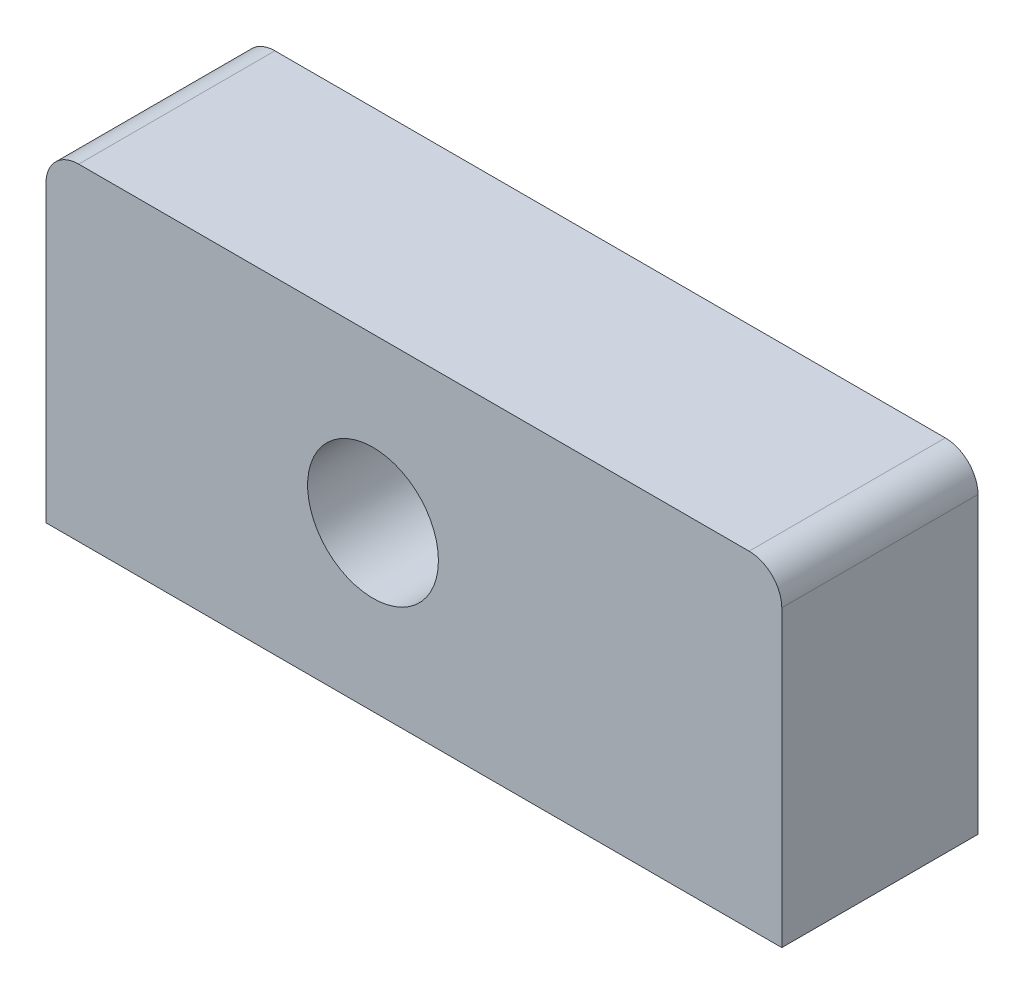
ISO-10303-21;
HEADER;
FILE_DESCRIPTION(('STEP AP214'),'2;1');
FILE_NAME('part.step','',(''),(''),'','','');
FILE_SCHEMA(('AUTOMOTIVE_DESIGN { 1 0 10303 214 1 1 1 1 }'));
ENDSEC;
DATA;
#1=APPLICATION_CONTEXT('core data for automotive mechanical design processes');
#2=APPLICATION_PROTOCOL_DEFINITION('international standard','automotive_design',2000,#1);
#3=PRODUCT_CONTEXT('',#1,'mechanical');
#4=PRODUCT('Part','Part','',(#3));
#5=PRODUCT_RELATED_PRODUCT_CATEGORY('part','',(#4));
#6=PRODUCT_DEFINITION_FORMATION('','',#4);
#7=PRODUCT_DEFINITION_CONTEXT('part definition',#1,'design');
#8=PRODUCT_DEFINITION('design','',#6,#7);
#9=PRODUCT_DEFINITION_SHAPE('','',#8);
#10=(LENGTH_UNIT() NAMED_UNIT(*) SI_UNIT(.MILLI.,.METRE.));
#11=(NAMED_UNIT(*) PLANE_ANGLE_UNIT() SI_UNIT($,.RADIAN.));
#12=(NAMED_UNIT(*) SI_UNIT($,.STERADIAN.) SOLID_ANGLE_UNIT());
#13=UNCERTAINTY_MEASURE_WITH_UNIT(LENGTH_MEASURE(1.E-05),#10,'distance_accuracy_value','');
#14=(GEOMETRIC_REPRESENTATION_CONTEXT(3) GLOBAL_UNCERTAINTY_ASSIGNED_CONTEXT((#13)) GLOBAL_UNIT_ASSIGNED_CONTEXT((#10,
#11,#12)) REPRESENTATION_CONTEXT('',''));
#15=CARTESIAN_POINT('',(0.,0.,0.));
#16=DIRECTION('',(0.,0.,1.));
#17=DIRECTION('',(1.,0.,0.));
#18=AXIS2_PLACEMENT_3D('',#15,#16,#17);
#19=CARTESIAN_POINT('',(0.,0.,12.));
#20=DIRECTION('',(0.,0.,-1.));
#21=DIRECTION('',(-1.,0.,0.));
#22=AXIS2_PLACEMENT_3D('',#19,#20,#21);
#23=PLANE('',#22);
#24=DIRECTION('',(0.,1.,0.));
#25=VECTOR('',#24,1.);
#26=CARTESIAN_POINT('',(45.,0.,12.));
#27=LINE('',#26,#25);
#28=CARTESIAN_POINT('',(45.,0.,12.));
#29=VERTEX_POINT('',#28);
#30=CARTESIAN_POINT('',(45.,18.,12.));
#31=VERTEX_POINT('',#30);
#32=EDGE_CURVE('E104',#29,#31,#27,.T.);
#33=ORIENTED_EDGE('',*,*,#32,.T.);
#34=CARTESIAN_POINT('',(43.,18.,12.));
#35=DIRECTION('',(0.,0.,-1.));
#36=DIRECTION('',(-1.,0.,0.));
#37=AXIS2_PLACEMENT_3D('',#34,#35,#36);
#38=CIRCLE('',#37,2.);
#39=CARTESIAN_POINT('',(43.,20.,12.));
#40=VERTEX_POINT('',#39);
#41=EDGE_CURVE('E43',#31,#40,#38,.F.);
#42=ORIENTED_EDGE('',*,*,#41,.T.);
#43=DIRECTION('',(-1.,0.,0.));
#44=VECTOR('',#43,1.);
#45=CARTESIAN_POINT('',(0.,20.,12.));
#46=LINE('',#45,#44);
#47=CARTESIAN_POINT('',(2.,20.,12.));
#48=VERTEX_POINT('',#47);
#49=EDGE_CURVE('E114',#40,#48,#46,.T.);
#50=ORIENTED_EDGE('',*,*,#49,.T.);
#51=CARTESIAN_POINT('',(2.,18.,12.));
#52=DIRECTION('',(0.,0.,-1.));
#53=DIRECTION('',(-1.,0.,0.));
#54=AXIS2_PLACEMENT_3D('',#51,#52,#53);
#55=CIRCLE('',#54,2.);
#56=CARTESIAN_POINT('',(0.,18.,12.));
#57=VERTEX_POINT('',#56);
#58=EDGE_CURVE('E50',#48,#57,#55,.F.);
#59=ORIENTED_EDGE('',*,*,#58,.T.);
#60=DIRECTION('',(0.,-1.,0.));
#61=VECTOR('',#60,1.);
#62=CARTESIAN_POINT('',(0.,0.,12.));
#63=LINE('',#62,#61);
#64=CARTESIAN_POINT('',(0.,0.,12.));
#65=VERTEX_POINT('',#64);
#66=EDGE_CURVE('E88',#57,#65,#63,.T.);
#67=ORIENTED_EDGE('',*,*,#66,.T.);
#68=DIRECTION('',(1.,0.,0.));
#69=VECTOR('',#68,1.);
#70=CARTESIAN_POINT('',(0.,0.,12.));
#71=LINE('',#70,#69);
#72=EDGE_CURVE('E91',#65,#29,#71,.T.);
#73=ORIENTED_EDGE('',*,*,#72,.T.);
#74=EDGE_LOOP('',(#33,#42,#50,#59,#67,#73));
#75=FACE_BOUND('',#74,.T.);
#76=CARTESIAN_POINT('',(20.,10.,12.));
#77=DIRECTION('',(0.,0.,1.));
#78=DIRECTION('',(1.,0.,0.));
#79=AXIS2_PLACEMENT_3D('',#76,#77,#78);
#80=CIRCLE('',#79,4.);
#81=CARTESIAN_POINT('',(24.,10.,12.));
#82=VERTEX_POINT('',#81);
#83=EDGE_CURVE('E146',#82,#82,#80,.T.);
#84=ORIENTED_EDGE('',*,*,#83,.F.);
#85=EDGE_LOOP('',(#84));
#86=FACE_BOUND('',#85,.T.);
#87=ADVANCED_FACE('F35',(#75,#86),#23,.F.);
#88=CARTESIAN_POINT('',(0.,0.,0.));
#89=DIRECTION('',(0.,0.,-1.));
#90=DIRECTION('',(-1.,0.,0.));
#91=AXIS2_PLACEMENT_3D('',#88,#89,#90);
#92=PLANE('',#91);
#93=DIRECTION('',(-1.,0.,0.));
#94=VECTOR('',#93,1.);
#95=CARTESIAN_POINT('',(0.,20.,0.));
#96=LINE('',#95,#94);
#97=CARTESIAN_POINT('',(43.,20.,0.));
#98=VERTEX_POINT('',#97);
#99=CARTESIAN_POINT('',(2.,20.,0.));
#100=VERTEX_POINT('',#99);
#101=EDGE_CURVE('E96',#98,#100,#96,.T.);
#102=ORIENTED_EDGE('',*,*,#101,.F.);
#103=CARTESIAN_POINT('',(43.,18.,0.));
#104=DIRECTION('',(0.,0.,-1.));
#105=DIRECTION('',(-1.,0.,0.));
#106=AXIS2_PLACEMENT_3D('',#103,#104,#105);
#107=CIRCLE('',#106,2.);
#108=CARTESIAN_POINT('',(45.,18.,0.));
#109=VERTEX_POINT('',#108);
#110=EDGE_CURVE('E122',#98,#109,#107,.T.);
#111=ORIENTED_EDGE('',*,*,#110,.T.);
#112=DIRECTION('',(0.,1.,0.));
#113=VECTOR('',#112,1.);
#114=CARTESIAN_POINT('',(45.,0.,0.));
#115=LINE('',#114,#113);
#116=CARTESIAN_POINT('',(45.,0.,0.));
#117=VERTEX_POINT('',#116);
#118=EDGE_CURVE('E140',#117,#109,#115,.T.);
#119=ORIENTED_EDGE('',*,*,#118,.F.);
#120=DIRECTION('',(1.,0.,0.));
#121=VECTOR('',#120,1.);
#122=CARTESIAN_POINT('',(0.,0.,0.));
#123=LINE('',#122,#121);
#124=CARTESIAN_POINT('',(0.,0.,0.));
#125=VERTEX_POINT('',#124);
#126=EDGE_CURVE('E142',#125,#117,#123,.T.);
#127=ORIENTED_EDGE('',*,*,#126,.F.);
#128=DIRECTION('',(0.,-1.,0.));
#129=VECTOR('',#128,1.);
#130=CARTESIAN_POINT('',(0.,0.,0.));
#131=LINE('',#130,#129);
#132=CARTESIAN_POINT('',(0.,18.,0.));
#133=VERTEX_POINT('',#132);
#134=EDGE_CURVE('E108',#133,#125,#131,.T.);
#135=ORIENTED_EDGE('',*,*,#134,.F.);
#136=CARTESIAN_POINT('',(2.,18.,0.));
#137=DIRECTION('',(0.,0.,-1.));
#138=DIRECTION('',(-1.,0.,0.));
#139=AXIS2_PLACEMENT_3D('',#136,#137,#138);
#140=CIRCLE('',#139,2.);
#141=EDGE_CURVE('E120',#133,#100,#140,.T.);
#142=ORIENTED_EDGE('',*,*,#141,.T.);
#143=EDGE_LOOP('',(#102,#111,#119,#127,#135,#142));
#144=FACE_BOUND('',#143,.T.);
#145=CARTESIAN_POINT('',(20.,10.,0.));
#146=DIRECTION('',(0.,0.,1.));
#147=DIRECTION('',(1.,0.,0.));
#148=AXIS2_PLACEMENT_3D('',#145,#146,#147);
#149=CIRCLE('',#148,4.);
#150=CARTESIAN_POINT('',(24.,10.,0.));
#151=VERTEX_POINT('',#150);
#152=EDGE_CURVE('E150',#151,#151,#149,.T.);
#153=ORIENTED_EDGE('',*,*,#152,.T.);
#154=EDGE_LOOP('',(#153));
#155=FACE_BOUND('',#154,.T.);
#156=ADVANCED_FACE('F138',(#144,#155),#92,.T.);
#157=CARTESIAN_POINT('',(0.,0.,12.));
#158=DIRECTION('',(1.,0.,0.));
#159=DIRECTION('',(0.,0.,-1.));
#160=AXIS2_PLACEMENT_3D('',#157,#158,#159);
#161=PLANE('',#160);
#162=ORIENTED_EDGE('',*,*,#66,.F.);
#163=DIRECTION('',(0.,0.,-1.));
#164=VECTOR('',#163,1.);
#165=CARTESIAN_POINT('',(0.,18.,12.));
#166=LINE('',#165,#164);
#167=EDGE_CURVE('E12',#57,#133,#166,.T.);
#168=ORIENTED_EDGE('',*,*,#167,.T.);
#169=ORIENTED_EDGE('',*,*,#134,.T.);
#170=DIRECTION('',(0.,0.,-1.));
#171=VECTOR('',#170,1.);
#172=CARTESIAN_POINT('',(0.,0.,12.));
#173=LINE('',#172,#171);
#174=EDGE_CURVE('E101',#65,#125,#173,.T.);
#175=ORIENTED_EDGE('',*,*,#174,.F.);
#176=EDGE_LOOP('',(#162,#168,#169,#175));
#177=FACE_BOUND('',#176,.T.);
#178=ADVANCED_FACE('F106',(#177),#161,.F.);
#179=CARTESIAN_POINT('',(0.,0.,12.));
#180=DIRECTION('',(0.,1.,0.));
#181=DIRECTION('',(0.,0.,1.));
#182=AXIS2_PLACEMENT_3D('',#179,#180,#181);
#183=PLANE('',#182);
#184=ORIENTED_EDGE('',*,*,#126,.T.);
#185=DIRECTION('',(0.,0.,-1.));
#186=VECTOR('',#185,1.);
#187=CARTESIAN_POINT('',(45.,0.,12.));
#188=LINE('',#187,#186);
#189=EDGE_CURVE('E103',#29,#117,#188,.T.);
#190=ORIENTED_EDGE('',*,*,#189,.F.);
#191=ORIENTED_EDGE('',*,*,#72,.F.);
#192=ORIENTED_EDGE('',*,*,#174,.T.);
#193=EDGE_LOOP('',(#184,#190,#191,#192));
#194=FACE_BOUND('',#193,.T.);
#195=ADVANCED_FACE('F100',(#194),#183,.F.);
#196=CARTESIAN_POINT('',(45.,0.,12.));
#197=DIRECTION('',(-1.,0.,0.));
#198=DIRECTION('',(0.,0.,1.));
#199=AXIS2_PLACEMENT_3D('',#196,#197,#198);
#200=PLANE('',#199);
#201=ORIENTED_EDGE('',*,*,#118,.T.);
#202=DIRECTION('',(0.,0.,-1.));
#203=VECTOR('',#202,1.);
#204=CARTESIAN_POINT('',(45.,18.,12.));
#205=LINE('',#204,#203);
#206=EDGE_CURVE('E58',#109,#31,#205,.F.);
#207=ORIENTED_EDGE('',*,*,#206,.T.);
#208=ORIENTED_EDGE('',*,*,#32,.F.);
#209=ORIENTED_EDGE('',*,*,#189,.T.);
#210=EDGE_LOOP('',(#201,#207,#208,#209));
#211=FACE_BOUND('',#210,.T.);
#212=ADVANCED_FACE('F141',(#211),#200,.F.);
#213=CARTESIAN_POINT('',(0.,20.,12.));
#214=DIRECTION('',(0.,-1.,0.));
#215=DIRECTION('',(0.,0.,-1.));
#216=AXIS2_PLACEMENT_3D('',#213,#214,#215);
#217=PLANE('',#216);
#218=ORIENTED_EDGE('',*,*,#49,.F.);
#219=DIRECTION('',(0.,0.,-1.));
#220=VECTOR('',#219,1.);
#221=CARTESIAN_POINT('',(43.,20.,12.));
#222=LINE('',#221,#220);
#223=EDGE_CURVE('E112',#40,#98,#222,.T.);
#224=ORIENTED_EDGE('',*,*,#223,.T.);
#225=ORIENTED_EDGE('',*,*,#101,.T.);
#226=DIRECTION('',(0.,0.,-1.));
#227=VECTOR('',#226,1.);
#228=CARTESIAN_POINT('',(2.,20.,12.));
#229=LINE('',#228,#227);
#230=EDGE_CURVE('E110',#100,#48,#229,.F.);
#231=ORIENTED_EDGE('',*,*,#230,.T.);
#232=EDGE_LOOP('',(#218,#224,#225,#231));
#233=FACE_BOUND('',#232,.T.);
#234=ADVANCED_FACE('F130',(#233),#217,.F.);
#235=CARTESIAN_POINT('',(20.,10.,12.));
#236=DIRECTION('',(0.,0.,-1.));
#237=DIRECTION('',(-1.,0.,0.));
#238=AXIS2_PLACEMENT_3D('',#235,#236,#237);
#239=CYLINDRICAL_SURFACE('',#238,4.);
#240=ORIENTED_EDGE('',*,*,#83,.T.);
#241=EDGE_LOOP('',(#240));
#242=FACE_BOUND('',#241,.T.);
#243=ORIENTED_EDGE('',*,*,#152,.F.);
#244=EDGE_LOOP('',(#243));
#245=FACE_BOUND('',#244,.T.);
#246=ADVANCED_FACE('F160',(#242,#245),#239,.F.);
#247=CARTESIAN_POINT('',(43.,18.,12.));
#248=DIRECTION('',(0.,0.,-1.));
#249=DIRECTION('',(-1.,0.,0.));
#250=AXIS2_PLACEMENT_3D('',#247,#248,#249);
#251=CYLINDRICAL_SURFACE('',#250,2.);
#252=ORIENTED_EDGE('',*,*,#41,.F.);
#253=ORIENTED_EDGE('',*,*,#206,.F.);
#254=ORIENTED_EDGE('',*,*,#110,.F.);
#255=ORIENTED_EDGE('',*,*,#223,.F.);
#256=EDGE_LOOP('',(#252,#253,#254,#255));
#257=FACE_BOUND('',#256,.T.);
#258=ADVANCED_FACE('F135',(#257),#251,.T.);
#259=CARTESIAN_POINT('',(2.,18.,12.));
#260=DIRECTION('',(0.,0.,-1.));
#261=DIRECTION('',(-1.,0.,0.));
#262=AXIS2_PLACEMENT_3D('',#259,#260,#261);
#263=CYLINDRICAL_SURFACE('',#262,2.);
#264=ORIENTED_EDGE('',*,*,#58,.F.);
#265=ORIENTED_EDGE('',*,*,#230,.F.);
#266=ORIENTED_EDGE('',*,*,#141,.F.);
#267=ORIENTED_EDGE('',*,*,#167,.F.);
#268=EDGE_LOOP('',(#264,#265,#266,#267));
#269=FACE_BOUND('',#268,.T.);
#270=ADVANCED_FACE('F37',(#269),#263,.T.);
#271=CLOSED_SHELL('',(#87,#156,#178,#195,#212,#234,#246,#258,#270));
#272=MANIFOLD_SOLID_BREP('B2',#271);
#273=ADVANCED_BREP_SHAPE_REPRESENTATION('',(#18,#272),#14);
#274=SHAPE_DEFINITION_REPRESENTATION(#9,#273);
ENDSEC;
END-ISO-10303-21;
